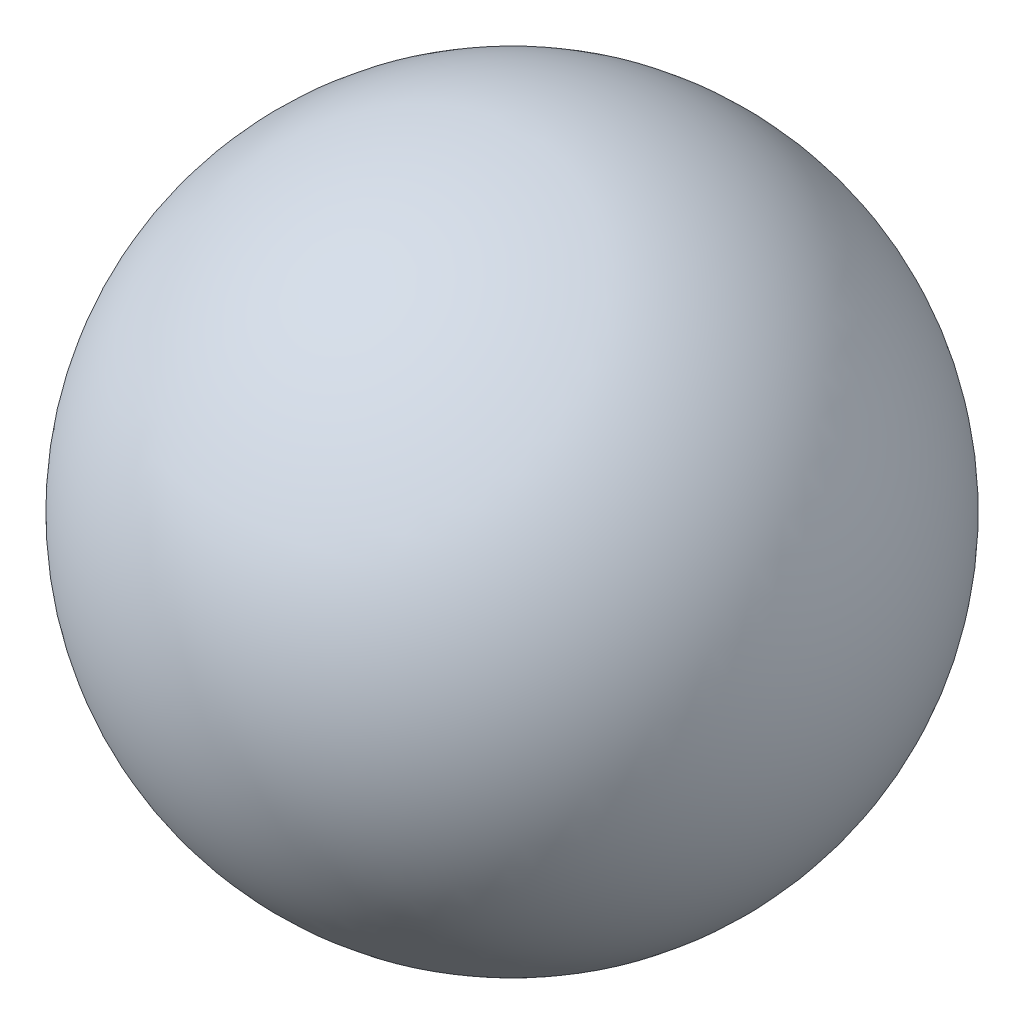
ISO-10303-21;
HEADER;
FILE_DESCRIPTION(('STEP AP214'),'2;1');
FILE_NAME('part.step','',(''),(''),'','','');
FILE_SCHEMA(('AUTOMOTIVE_DESIGN { 1 0 10303 214 1 1 1 1 }'));
ENDSEC;
DATA;
#1=APPLICATION_CONTEXT('core data for automotive mechanical design processes');
#2=APPLICATION_PROTOCOL_DEFINITION('international standard','automotive_design',2000,#1);
#3=PRODUCT_CONTEXT('',#1,'mechanical');
#4=PRODUCT('Part','Part','',(#3));
#5=PRODUCT_RELATED_PRODUCT_CATEGORY('part','',(#4));
#6=PRODUCT_DEFINITION_FORMATION('','',#4);
#7=PRODUCT_DEFINITION_CONTEXT('part definition',#1,'design');
#8=PRODUCT_DEFINITION('design','',#6,#7);
#9=PRODUCT_DEFINITION_SHAPE('','',#8);
#10=(LENGTH_UNIT() NAMED_UNIT(*) SI_UNIT(.MILLI.,.METRE.));
#11=(NAMED_UNIT(*) PLANE_ANGLE_UNIT() SI_UNIT($,.RADIAN.));
#12=(NAMED_UNIT(*) SI_UNIT($,.STERADIAN.) SOLID_ANGLE_UNIT());
#13=UNCERTAINTY_MEASURE_WITH_UNIT(LENGTH_MEASURE(1.E-05),#10,'distance_accuracy_value','');
#14=(GEOMETRIC_REPRESENTATION_CONTEXT(3) GLOBAL_UNCERTAINTY_ASSIGNED_CONTEXT((#13)) GLOBAL_UNIT_ASSIGNED_CONTEXT((#10,
#11,#12)) REPRESENTATION_CONTEXT('',''));
#15=CARTESIAN_POINT('',(0.,0.,0.));
#16=DIRECTION('',(0.,0.,1.));
#17=DIRECTION('',(1.,0.,0.));
#18=AXIS2_PLACEMENT_3D('',#15,#16,#17);
#19=CARTESIAN_POINT('',(0.,0.,0.));
#20=DIRECTION('',(0.,1.,0.));
#21=DIRECTION('',(1.,0.,0.));
#22=AXIS2_PLACEMENT_3D('',#19,#20,#21);
#23=SPHERICAL_SURFACE('',#22,1.985);
#24=CARTESIAN_POINT('',(0.,1.985,0.));
#25=VERTEX_POINT('',#24);
#26=VERTEX_LOOP('',#25);
#27=FACE_BOUND('',#26,.T.);
#28=ADVANCED_FACE('F29',(#27),#23,.T.);
#29=CLOSED_SHELL('',(#28));
#30=MANIFOLD_SOLID_BREP('B2',#29);
#31=ADVANCED_BREP_SHAPE_REPRESENTATION('',(#18,#30),#14);
#32=SHAPE_DEFINITION_REPRESENTATION(#9,#31);
ENDSEC;
END-ISO-10303-21;
